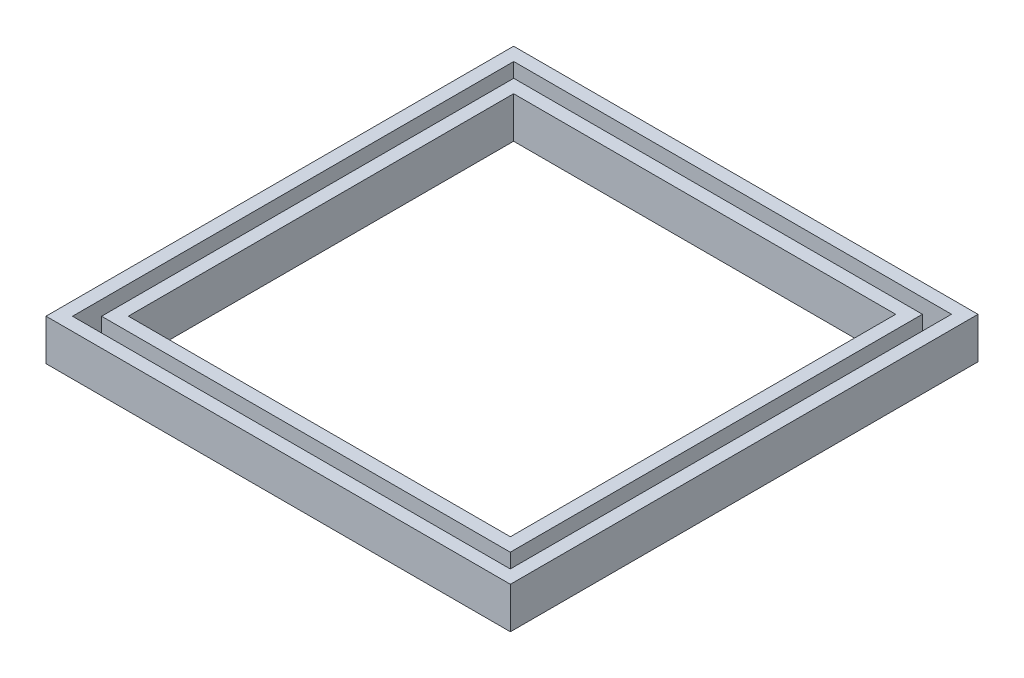
ISO-10303-21;
HEADER;
FILE_DESCRIPTION(('STEP AP214'),'2;1');
FILE_NAME('part.step','',(''),(''),'','','');
FILE_SCHEMA(('AUTOMOTIVE_DESIGN { 1 0 10303 214 1 1 1 1 }'));
ENDSEC;
DATA;
#1=APPLICATION_CONTEXT('core data for automotive mechanical design processes');
#2=APPLICATION_PROTOCOL_DEFINITION('international standard','automotive_design',2000,#1);
#3=PRODUCT_CONTEXT('',#1,'mechanical');
#4=PRODUCT('Part','Part','',(#3));
#5=PRODUCT_RELATED_PRODUCT_CATEGORY('part','',(#4));
#6=PRODUCT_DEFINITION_FORMATION('','',#4);
#7=PRODUCT_DEFINITION_CONTEXT('part definition',#1,'design');
#8=PRODUCT_DEFINITION('design','',#6,#7);
#9=PRODUCT_DEFINITION_SHAPE('','',#8);
#10=(LENGTH_UNIT() NAMED_UNIT(*) SI_UNIT(.MILLI.,.METRE.));
#11=(NAMED_UNIT(*) PLANE_ANGLE_UNIT() SI_UNIT($,.RADIAN.));
#12=(NAMED_UNIT(*) SI_UNIT($,.STERADIAN.) SOLID_ANGLE_UNIT());
#13=UNCERTAINTY_MEASURE_WITH_UNIT(LENGTH_MEASURE(1.E-05),#10,'distance_accuracy_value','');
#14=(GEOMETRIC_REPRESENTATION_CONTEXT(3) GLOBAL_UNCERTAINTY_ASSIGNED_CONTEXT((#13)) GLOBAL_UNIT_ASSIGNED_CONTEXT((#10,
#11,#12)) REPRESENTATION_CONTEXT('',''));
#15=CARTESIAN_POINT('',(0.,0.,0.));
#16=DIRECTION('',(0.,0.,1.));
#17=DIRECTION('',(1.,0.,0.));
#18=AXIS2_PLACEMENT_3D('',#15,#16,#17);
#19=CARTESIAN_POINT('',(0.,19.05,108.207890451517));
#20=DIRECTION('',(0.,0.,-1.));
#21=DIRECTION('',(-1.,0.,0.));
#22=AXIS2_PLACEMENT_3D('',#19,#20,#21);
#23=PLANE('',#22);
#24=DIRECTION('',(1.,0.,0.));
#25=VECTOR('',#24,1.);
#26=CARTESIAN_POINT('',(0.,0.,108.207890451517));
#27=LINE('',#26,#25);
#28=CARTESIAN_POINT('',(-107.46,0.,108.207890451517));
#29=VERTEX_POINT('',#28);
#30=CARTESIAN_POINT('',(107.46,0.,108.207890451517));
#31=VERTEX_POINT('',#30);
#32=EDGE_CURVE('E193',#29,#31,#27,.T.);
#33=ORIENTED_EDGE('',*,*,#32,.T.);
#34=DIRECTION('',(0.,-1.,0.));
#35=VECTOR('',#34,1.);
#36=CARTESIAN_POINT('',(107.46,19.05,108.207890451517));
#37=LINE('',#36,#35);
#38=CARTESIAN_POINT('',(107.46,19.05,108.207890451517));
#39=VERTEX_POINT('',#38);
#40=EDGE_CURVE('E13',#39,#31,#37,.T.);
#41=ORIENTED_EDGE('',*,*,#40,.F.);
#42=DIRECTION('',(1.,0.,0.));
#43=VECTOR('',#42,1.);
#44=CARTESIAN_POINT('',(0.,19.05,108.207890451517));
#45=LINE('',#44,#43);
#46=CARTESIAN_POINT('',(-107.46,19.05,108.207890451517));
#47=VERTEX_POINT('',#46);
#48=EDGE_CURVE('E157',#47,#39,#45,.T.);
#49=ORIENTED_EDGE('',*,*,#48,.F.);
#50=DIRECTION('',(0.,-1.,0.));
#51=VECTOR('',#50,1.);
#52=CARTESIAN_POINT('',(-107.46,19.05,108.207890451517));
#53=LINE('',#52,#51);
#54=EDGE_CURVE('E97',#47,#29,#53,.T.);
#55=ORIENTED_EDGE('',*,*,#54,.T.);
#56=EDGE_LOOP('',(#33,#41,#49,#55));
#57=FACE_BOUND('',#56,.T.);
#58=ADVANCED_FACE('F77',(#57),#23,.F.);
#59=CARTESIAN_POINT('',(107.46,19.05,0.));
#60=DIRECTION('',(-1.,0.,0.));
#61=DIRECTION('',(0.,0.,1.));
#62=AXIS2_PLACEMENT_3D('',#59,#60,#61);
#63=PLANE('',#62);
#64=DIRECTION('',(0.,0.,-1.));
#65=VECTOR('',#64,1.);
#66=CARTESIAN_POINT('',(107.46,0.,0.));
#67=LINE('',#66,#65);
#68=CARTESIAN_POINT('',(107.46,0.,-108.207890451517));
#69=VERTEX_POINT('',#68);
#70=EDGE_CURVE('E164',#31,#69,#67,.T.);
#71=ORIENTED_EDGE('',*,*,#70,.T.);
#72=DIRECTION('',(0.,-1.,0.));
#73=VECTOR('',#72,1.);
#74=CARTESIAN_POINT('',(107.46,19.05,-108.207890451517));
#75=LINE('',#74,#73);
#76=CARTESIAN_POINT('',(107.46,19.05,-108.207890451517));
#77=VERTEX_POINT('',#76);
#78=EDGE_CURVE('E88',#77,#69,#75,.T.);
#79=ORIENTED_EDGE('',*,*,#78,.F.);
#80=DIRECTION('',(0.,0.,-1.));
#81=VECTOR('',#80,1.);
#82=CARTESIAN_POINT('',(107.46,19.05,0.));
#83=LINE('',#82,#81);
#84=EDGE_CURVE('E151',#39,#77,#83,.T.);
#85=ORIENTED_EDGE('',*,*,#84,.F.);
#86=ORIENTED_EDGE('',*,*,#40,.T.);
#87=EDGE_LOOP('',(#71,#79,#85,#86));
#88=FACE_BOUND('',#87,.T.);
#89=ADVANCED_FACE('F163',(#88),#63,.F.);
#90=CARTESIAN_POINT('',(0.,19.05,-108.207890451517));
#91=DIRECTION('',(0.,0.,-1.));
#92=DIRECTION('',(-1.,0.,0.));
#93=AXIS2_PLACEMENT_3D('',#90,#91,#92);
#94=PLANE('',#93);
#95=DIRECTION('',(1.,0.,0.));
#96=VECTOR('',#95,1.);
#97=CARTESIAN_POINT('',(0.,0.,-108.207890451517));
#98=LINE('',#97,#96);
#99=CARTESIAN_POINT('',(-107.46,0.,-108.207890451517));
#100=VERTEX_POINT('',#99);
#101=EDGE_CURVE('E198',#100,#69,#98,.T.);
#102=ORIENTED_EDGE('',*,*,#101,.F.);
#103=DIRECTION('',(0.,-1.,0.));
#104=VECTOR('',#103,1.);
#105=CARTESIAN_POINT('',(-107.46,19.05,-108.207890451517));
#106=LINE('',#105,#104);
#107=CARTESIAN_POINT('',(-107.46,19.05,-108.207890451517));
#108=VERTEX_POINT('',#107);
#109=EDGE_CURVE('E123',#108,#100,#106,.T.);
#110=ORIENTED_EDGE('',*,*,#109,.F.);
#111=DIRECTION('',(1.,0.,0.));
#112=VECTOR('',#111,1.);
#113=CARTESIAN_POINT('',(0.,19.05,-108.207890451517));
#114=LINE('',#113,#112);
#115=EDGE_CURVE('E156',#108,#77,#114,.T.);
#116=ORIENTED_EDGE('',*,*,#115,.T.);
#117=ORIENTED_EDGE('',*,*,#78,.T.);
#118=EDGE_LOOP('',(#102,#110,#116,#117));
#119=FACE_BOUND('',#118,.T.);
#120=ADVANCED_FACE('F169',(#119),#94,.T.);
#121=CARTESIAN_POINT('',(101.3,19.05,0.));
#122=DIRECTION('',(-1.,0.,0.));
#123=DIRECTION('',(0.,0.,1.));
#124=AXIS2_PLACEMENT_3D('',#121,#122,#123);
#125=PLANE('',#124);
#126=DIRECTION('',(0.,0.,-1.));
#127=VECTOR('',#126,1.);
#128=CARTESIAN_POINT('',(101.3,0.,0.));
#129=LINE('',#128,#127);
#130=CARTESIAN_POINT('',(101.3,0.,102.1));
#131=VERTEX_POINT('',#130);
#132=CARTESIAN_POINT('',(101.3,0.,-102.1));
#133=VERTEX_POINT('',#132);
#134=EDGE_CURVE('E178',#131,#133,#129,.T.);
#135=ORIENTED_EDGE('',*,*,#134,.F.);
#136=DIRECTION('',(0.,-1.,0.));
#137=VECTOR('',#136,1.);
#138=CARTESIAN_POINT('',(101.3,19.05,102.1));
#139=LINE('',#138,#137);
#140=CARTESIAN_POINT('',(101.3,19.05,102.1));
#141=VERTEX_POINT('',#140);
#142=EDGE_CURVE('E81',#141,#131,#139,.T.);
#143=ORIENTED_EDGE('',*,*,#142,.F.);
#144=DIRECTION('',(0.,0.,-1.));
#145=VECTOR('',#144,1.);
#146=CARTESIAN_POINT('',(101.3,19.05,0.));
#147=LINE('',#146,#145);
#148=CARTESIAN_POINT('',(101.3,19.05,-102.1));
#149=VERTEX_POINT('',#148);
#150=EDGE_CURVE('E205',#141,#149,#147,.T.);
#151=ORIENTED_EDGE('',*,*,#150,.T.);
#152=DIRECTION('',(0.,-1.,0.));
#153=VECTOR('',#152,1.);
#154=CARTESIAN_POINT('',(101.3,19.05,-102.1));
#155=LINE('',#154,#153);
#156=EDGE_CURVE('E174',#149,#133,#155,.T.);
#157=ORIENTED_EDGE('',*,*,#156,.T.);
#158=EDGE_LOOP('',(#135,#143,#151,#157));
#159=FACE_BOUND('',#158,.T.);
#160=ADVANCED_FACE('F79',(#159),#125,.T.);
#161=CARTESIAN_POINT('',(0.,19.05,102.1));
#162=DIRECTION('',(0.,0.,-1.));
#163=DIRECTION('',(-1.,0.,0.));
#164=AXIS2_PLACEMENT_3D('',#161,#162,#163);
#165=PLANE('',#164);
#166=DIRECTION('',(1.,0.,0.));
#167=VECTOR('',#166,1.);
#168=CARTESIAN_POINT('',(0.,0.,102.1));
#169=LINE('',#168,#167);
#170=CARTESIAN_POINT('',(-101.3,0.,102.1));
#171=VERTEX_POINT('',#170);
#172=EDGE_CURVE('E182',#171,#131,#169,.T.);
#173=ORIENTED_EDGE('',*,*,#172,.F.);
#174=DIRECTION('',(0.,-1.,0.));
#175=VECTOR('',#174,1.);
#176=CARTESIAN_POINT('',(-101.3,19.05,102.1));
#177=LINE('',#176,#175);
#178=CARTESIAN_POINT('',(-101.3,19.05,102.1));
#179=VERTEX_POINT('',#178);
#180=EDGE_CURVE('E215',#179,#171,#177,.T.);
#181=ORIENTED_EDGE('',*,*,#180,.F.);
#182=DIRECTION('',(1.,0.,0.));
#183=VECTOR('',#182,1.);
#184=CARTESIAN_POINT('',(0.,19.05,102.1));
#185=LINE('',#184,#183);
#186=EDGE_CURVE('E226',#179,#141,#185,.T.);
#187=ORIENTED_EDGE('',*,*,#186,.T.);
#188=ORIENTED_EDGE('',*,*,#142,.T.);
#189=EDGE_LOOP('',(#173,#181,#187,#188));
#190=FACE_BOUND('',#189,.T.);
#191=ADVANCED_FACE('F224',(#190),#165,.T.);
#192=CARTESIAN_POINT('',(-101.3,19.05,0.));
#193=DIRECTION('',(-1.,0.,0.));
#194=DIRECTION('',(0.,0.,1.));
#195=AXIS2_PLACEMENT_3D('',#192,#193,#194);
#196=PLANE('',#195);
#197=DIRECTION('',(0.,0.,-1.));
#198=VECTOR('',#197,1.);
#199=CARTESIAN_POINT('',(-101.3,0.,0.));
#200=LINE('',#199,#198);
#201=CARTESIAN_POINT('',(-101.3,0.,-102.1));
#202=VERTEX_POINT('',#201);
#203=EDGE_CURVE('E186',#171,#202,#200,.T.);
#204=ORIENTED_EDGE('',*,*,#203,.T.);
#205=DIRECTION('',(0.,-1.,0.));
#206=VECTOR('',#205,1.);
#207=CARTESIAN_POINT('',(-101.3,19.05,-102.1));
#208=LINE('',#207,#206);
#209=CARTESIAN_POINT('',(-101.3,19.05,-102.1));
#210=VERTEX_POINT('',#209);
#211=EDGE_CURVE('E212',#210,#202,#208,.T.);
#212=ORIENTED_EDGE('',*,*,#211,.F.);
#213=DIRECTION('',(0.,0.,-1.));
#214=VECTOR('',#213,1.);
#215=CARTESIAN_POINT('',(-101.3,19.05,0.));
#216=LINE('',#215,#214);
#217=EDGE_CURVE('E240',#179,#210,#216,.T.);
#218=ORIENTED_EDGE('',*,*,#217,.F.);
#219=ORIENTED_EDGE('',*,*,#180,.T.);
#220=EDGE_LOOP('',(#204,#212,#218,#219));
#221=FACE_BOUND('',#220,.T.);
#222=ADVANCED_FACE('F233',(#221),#196,.F.);
#223=CARTESIAN_POINT('',(0.,19.05,-102.1));
#224=DIRECTION('',(0.,0.,-1.));
#225=DIRECTION('',(-1.,0.,0.));
#226=AXIS2_PLACEMENT_3D('',#223,#224,#225);
#227=PLANE('',#226);
#228=DIRECTION('',(1.,0.,0.));
#229=VECTOR('',#228,1.);
#230=CARTESIAN_POINT('',(0.,0.,-102.1));
#231=LINE('',#230,#229);
#232=EDGE_CURVE('E189',#202,#133,#231,.T.);
#233=ORIENTED_EDGE('',*,*,#232,.T.);
#234=ORIENTED_EDGE('',*,*,#156,.F.);
#235=DIRECTION('',(1.,0.,0.));
#236=VECTOR('',#235,1.);
#237=CARTESIAN_POINT('',(0.,19.05,-102.1));
#238=LINE('',#237,#236);
#239=EDGE_CURVE('E237',#210,#149,#238,.T.);
#240=ORIENTED_EDGE('',*,*,#239,.F.);
#241=ORIENTED_EDGE('',*,*,#211,.T.);
#242=EDGE_LOOP('',(#233,#234,#240,#241));
#243=FACE_BOUND('',#242,.T.);
#244=ADVANCED_FACE('F236',(#243),#227,.F.);
#245=CARTESIAN_POINT('',(-107.46,19.05,0.));
#246=DIRECTION('',(-1.,0.,0.));
#247=DIRECTION('',(0.,0.,1.));
#248=AXIS2_PLACEMENT_3D('',#245,#246,#247);
#249=PLANE('',#248);
#250=DIRECTION('',(0.,0.,-1.));
#251=VECTOR('',#250,1.);
#252=CARTESIAN_POINT('',(-107.46,0.,0.));
#253=LINE('',#252,#251);
#254=EDGE_CURVE('E201',#29,#100,#253,.T.);
#255=ORIENTED_EDGE('',*,*,#254,.F.);
#256=ORIENTED_EDGE('',*,*,#54,.F.);
#257=DIRECTION('',(0.,0.,-1.));
#258=VECTOR('',#257,1.);
#259=CARTESIAN_POINT('',(-107.46,19.05,0.));
#260=LINE('',#259,#258);
#261=EDGE_CURVE('E171',#47,#108,#260,.T.);
#262=ORIENTED_EDGE('',*,*,#261,.T.);
#263=ORIENTED_EDGE('',*,*,#109,.T.);
#264=EDGE_LOOP('',(#255,#256,#262,#263));
#265=FACE_BOUND('',#264,.T.);
#266=ADVANCED_FACE('F250',(#265),#249,.T.);
#267=CARTESIAN_POINT('',(0.,19.05,0.));
#268=DIRECTION('',(0.,1.,0.));
#269=DIRECTION('',(0.,0.,1.));
#270=AXIS2_PLACEMENT_3D('',#267,#268,#269);
#271=PLANE('',#270);
#272=ORIENTED_EDGE('',*,*,#150,.F.);
#273=ORIENTED_EDGE('',*,*,#186,.F.);
#274=ORIENTED_EDGE('',*,*,#217,.T.);
#275=ORIENTED_EDGE('',*,*,#239,.T.);
#276=EDGE_LOOP('',(#272,#273,#274,#275));
#277=FACE_BOUND('',#276,.T.);
#278=ORIENTED_EDGE('',*,*,#48,.T.);
#279=ORIENTED_EDGE('',*,*,#84,.T.);
#280=ORIENTED_EDGE('',*,*,#115,.F.);
#281=ORIENTED_EDGE('',*,*,#261,.F.);
#282=EDGE_LOOP('',(#278,#279,#280,#281));
#283=FACE_BOUND('',#282,.T.);
#284=ADVANCED_FACE('F153',(#277,#283),#271,.T.);
#285=CARTESIAN_POINT('',(0.,0.,0.));
#286=DIRECTION('',(0.,1.,0.));
#287=DIRECTION('',(0.,0.,1.));
#288=AXIS2_PLACEMENT_3D('',#285,#286,#287);
#289=PLANE('',#288);
#290=ORIENTED_EDGE('',*,*,#134,.T.);
#291=ORIENTED_EDGE('',*,*,#232,.F.);
#292=ORIENTED_EDGE('',*,*,#203,.F.);
#293=ORIENTED_EDGE('',*,*,#172,.T.);
#294=EDGE_LOOP('',(#290,#291,#292,#293));
#295=FACE_BOUND('',#294,.T.);
#296=ORIENTED_EDGE('',*,*,#32,.F.);
#297=ORIENTED_EDGE('',*,*,#254,.T.);
#298=ORIENTED_EDGE('',*,*,#101,.T.);
#299=ORIENTED_EDGE('',*,*,#70,.F.);
#300=EDGE_LOOP('',(#296,#297,#298,#299));
#301=FACE_BOUND('',#300,.T.);
#302=ADVANCED_FACE('F230',(#295,#301),#289,.F.);
#303=CLOSED_SHELL('',(#58,#89,#120,#160,#191,#222,#244,#266,#284,#302));
#304=MANIFOLD_SOLID_BREP('B2',#303);
#305=CARTESIAN_POINT('',(0.,19.05,95.37));
#306=DIRECTION('',(0.,0.,-1.));
#307=DIRECTION('',(-1.,0.,0.));
#308=AXIS2_PLACEMENT_3D('',#305,#306,#307);
#309=PLANE('',#308);
#310=DIRECTION('',(1.,0.,0.));
#311=VECTOR('',#310,1.);
#312=CARTESIAN_POINT('',(0.,0.,95.37));
#313=LINE('',#312,#311);
#314=CARTESIAN_POINT('',(-94.57,0.,95.37));
#315=VERTEX_POINT('',#314);
#316=CARTESIAN_POINT('',(94.57,0.,95.37));
#317=VERTEX_POINT('',#316);
#318=EDGE_CURVE('E458',#315,#317,#313,.T.);
#319=ORIENTED_EDGE('',*,*,#318,.T.);
#320=DIRECTION('',(0.,-1.,0.));
#321=VECTOR('',#320,1.);
#322=CARTESIAN_POINT('',(94.57,19.05,95.37));
#323=LINE('',#322,#321);
#324=CARTESIAN_POINT('',(94.57,19.05,95.37));
#325=VERTEX_POINT('',#324);
#326=EDGE_CURVE('E75',#325,#317,#323,.T.);
#327=ORIENTED_EDGE('',*,*,#326,.F.);
#328=DIRECTION('',(1.,0.,0.));
#329=VECTOR('',#328,1.);
#330=CARTESIAN_POINT('',(0.,19.05,95.37));
#331=LINE('',#330,#329);
#332=CARTESIAN_POINT('',(-94.57,19.05,95.37));
#333=VERTEX_POINT('',#332);
#334=EDGE_CURVE('E430',#333,#325,#331,.T.);
#335=ORIENTED_EDGE('',*,*,#334,.F.);
#336=DIRECTION('',(0.,-1.,0.));
#337=VECTOR('',#336,1.);
#338=CARTESIAN_POINT('',(-94.57,19.05,95.37));
#339=LINE('',#338,#337);
#340=EDGE_CURVE('E370',#333,#315,#339,.T.);
#341=ORIENTED_EDGE('',*,*,#340,.T.);
#342=EDGE_LOOP('',(#319,#327,#335,#341));
#343=FACE_BOUND('',#342,.T.);
#344=ADVANCED_FACE('F351',(#343),#309,.F.);
#345=CARTESIAN_POINT('',(94.57,19.05,0.));
#346=DIRECTION('',(-1.,0.,0.));
#347=DIRECTION('',(0.,0.,1.));
#348=AXIS2_PLACEMENT_3D('',#345,#346,#347);
#349=PLANE('',#348);
#350=DIRECTION('',(0.,0.,-1.));
#351=VECTOR('',#350,1.);
#352=CARTESIAN_POINT('',(94.57,0.,0.));
#353=LINE('',#352,#351);
#354=CARTESIAN_POINT('',(94.57,0.,-95.37));
#355=VERTEX_POINT('',#354);
#356=EDGE_CURVE('E436',#317,#355,#353,.T.);
#357=ORIENTED_EDGE('',*,*,#356,.T.);
#358=DIRECTION('',(0.,-1.,0.));
#359=VECTOR('',#358,1.);
#360=CARTESIAN_POINT('',(94.57,19.05,-95.37));
#361=LINE('',#360,#359);
#362=CARTESIAN_POINT('',(94.57,19.05,-95.37));
#363=VERTEX_POINT('',#362);
#364=EDGE_CURVE('E361',#363,#355,#361,.T.);
#365=ORIENTED_EDGE('',*,*,#364,.F.);
#366=DIRECTION('',(0.,0.,-1.));
#367=VECTOR('',#366,1.);
#368=CARTESIAN_POINT('',(94.57,19.05,0.));
#369=LINE('',#368,#367);
#370=EDGE_CURVE('E424',#325,#363,#369,.T.);
#371=ORIENTED_EDGE('',*,*,#370,.F.);
#372=ORIENTED_EDGE('',*,*,#326,.T.);
#373=EDGE_LOOP('',(#357,#365,#371,#372));
#374=FACE_BOUND('',#373,.T.);
#375=ADVANCED_FACE('F435',(#374),#349,.F.);
#376=CARTESIAN_POINT('',(0.,19.05,-95.37));
#377=DIRECTION('',(0.,0.,-1.));
#378=DIRECTION('',(-1.,0.,0.));
#379=AXIS2_PLACEMENT_3D('',#376,#377,#378);
#380=PLANE('',#379);
#381=DIRECTION('',(1.,0.,0.));
#382=VECTOR('',#381,1.);
#383=CARTESIAN_POINT('',(0.,0.,-95.37));
#384=LINE('',#383,#382);
#385=CARTESIAN_POINT('',(-94.57,0.,-95.37));
#386=VERTEX_POINT('',#385);
#387=EDGE_CURVE('E461',#386,#355,#384,.T.);
#388=ORIENTED_EDGE('',*,*,#387,.F.);
#389=DIRECTION('',(0.,-1.,0.));
#390=VECTOR('',#389,1.);
#391=CARTESIAN_POINT('',(-94.57,19.05,-95.37));
#392=LINE('',#391,#390);
#393=CARTESIAN_POINT('',(-94.57,19.05,-95.37));
#394=VERTEX_POINT('',#393);
#395=EDGE_CURVE('E396',#394,#386,#392,.T.);
#396=ORIENTED_EDGE('',*,*,#395,.F.);
#397=DIRECTION('',(1.,0.,0.));
#398=VECTOR('',#397,1.);
#399=CARTESIAN_POINT('',(0.,19.05,-95.37));
#400=LINE('',#399,#398);
#401=EDGE_CURVE('E429',#394,#363,#400,.T.);
#402=ORIENTED_EDGE('',*,*,#401,.T.);
#403=ORIENTED_EDGE('',*,*,#364,.T.);
#404=EDGE_LOOP('',(#388,#396,#402,#403));
#405=FACE_BOUND('',#404,.T.);
#406=ADVANCED_FACE('F440',(#405),#380,.T.);
#407=CARTESIAN_POINT('',(88.41,19.05,0.));
#408=DIRECTION('',(-1.,0.,0.));
#409=DIRECTION('',(0.,0.,1.));
#410=AXIS2_PLACEMENT_3D('',#407,#408,#409);
#411=PLANE('',#410);
#412=DIRECTION('',(0.,0.,-1.));
#413=VECTOR('',#412,1.);
#414=CARTESIAN_POINT('',(88.41,0.,0.));
#415=LINE('',#414,#413);
#416=CARTESIAN_POINT('',(88.41,0.,89.1578904515174));
#417=VERTEX_POINT('',#416);
#418=CARTESIAN_POINT('',(88.41,0.,-89.1578904515174));
#419=VERTEX_POINT('',#418);
#420=EDGE_CURVE('E447',#417,#419,#415,.T.);
#421=ORIENTED_EDGE('',*,*,#420,.F.);
#422=DIRECTION('',(0.,-1.,0.));
#423=VECTOR('',#422,1.);
#424=CARTESIAN_POINT('',(88.41,19.05,89.1578904515174));
#425=LINE('',#424,#423);
#426=CARTESIAN_POINT('',(88.41,19.05,89.1578904515174));
#427=VERTEX_POINT('',#426);
#428=EDGE_CURVE('E355',#427,#417,#425,.T.);
#429=ORIENTED_EDGE('',*,*,#428,.F.);
#430=DIRECTION('',(0.,0.,-1.));
#431=VECTOR('',#430,1.);
#432=CARTESIAN_POINT('',(88.41,19.05,0.));
#433=LINE('',#432,#431);
#434=CARTESIAN_POINT('',(88.41,19.05,-89.1578904515174));
#435=VERTEX_POINT('',#434);
#436=EDGE_CURVE('E466',#427,#435,#433,.T.);
#437=ORIENTED_EDGE('',*,*,#436,.T.);
#438=DIRECTION('',(0.,-1.,0.));
#439=VECTOR('',#438,1.);
#440=CARTESIAN_POINT('',(88.41,19.05,-89.1578904515174));
#441=LINE('',#440,#439);
#442=EDGE_CURVE('E443',#435,#419,#441,.T.);
#443=ORIENTED_EDGE('',*,*,#442,.T.);
#444=EDGE_LOOP('',(#421,#429,#437,#443));
#445=FACE_BOUND('',#444,.T.);
#446=ADVANCED_FACE('F353',(#445),#411,.T.);
#447=CARTESIAN_POINT('',(0.,19.05,89.1578904515174));
#448=DIRECTION('',(0.,0.,-1.));
#449=DIRECTION('',(-1.,0.,0.));
#450=AXIS2_PLACEMENT_3D('',#447,#448,#449);
#451=PLANE('',#450);
#452=DIRECTION('',(1.,0.,0.));
#453=VECTOR('',#452,1.);
#454=CARTESIAN_POINT('',(0.,0.,89.1578904515174));
#455=LINE('',#454,#453);
#456=CARTESIAN_POINT('',(-88.41,0.,89.1578904515174));
#457=VERTEX_POINT('',#456);
#458=EDGE_CURVE('E450',#457,#417,#455,.T.);
#459=ORIENTED_EDGE('',*,*,#458,.F.);
#460=DIRECTION('',(0.,-1.,0.));
#461=VECTOR('',#460,1.);
#462=CARTESIAN_POINT('',(-88.41,19.05,89.1578904515174));
#463=LINE('',#462,#461);
#464=CARTESIAN_POINT('',(-88.41,19.05,89.1578904515174));
#465=VERTEX_POINT('',#464);
#466=EDGE_CURVE('E472',#465,#457,#463,.T.);
#467=ORIENTED_EDGE('',*,*,#466,.F.);
#468=DIRECTION('',(1.,0.,0.));
#469=VECTOR('',#468,1.);
#470=CARTESIAN_POINT('',(0.,19.05,89.1578904515174));
#471=LINE('',#470,#469);
#472=EDGE_CURVE('E481',#465,#427,#471,.T.);
#473=ORIENTED_EDGE('',*,*,#472,.T.);
#474=ORIENTED_EDGE('',*,*,#428,.T.);
#475=EDGE_LOOP('',(#459,#467,#473,#474));
#476=FACE_BOUND('',#475,.T.);
#477=ADVANCED_FACE('F479',(#476),#451,.T.);
#478=CARTESIAN_POINT('',(-88.41,19.05,0.));
#479=DIRECTION('',(-1.,0.,0.));
#480=DIRECTION('',(0.,0.,1.));
#481=AXIS2_PLACEMENT_3D('',#478,#479,#480);
#482=PLANE('',#481);
#483=DIRECTION('',(0.,0.,-1.));
#484=VECTOR('',#483,1.);
#485=CARTESIAN_POINT('',(-88.41,0.,0.));
#486=LINE('',#485,#484);
#487=CARTESIAN_POINT('',(-88.41,0.,-89.1578904515174));
#488=VERTEX_POINT('',#487);
#489=EDGE_CURVE('E453',#457,#488,#486,.T.);
#490=ORIENTED_EDGE('',*,*,#489,.T.);
#491=DIRECTION('',(0.,-1.,0.));
#492=VECTOR('',#491,1.);
#493=CARTESIAN_POINT('',(-88.41,19.05,-89.1578904515174));
#494=LINE('',#493,#492);
#495=CARTESIAN_POINT('',(-88.41,19.05,-89.1578904515174));
#496=VERTEX_POINT('',#495);
#497=EDGE_CURVE('E470',#496,#488,#494,.T.);
#498=ORIENTED_EDGE('',*,*,#497,.F.);
#499=DIRECTION('',(0.,0.,-1.));
#500=VECTOR('',#499,1.);
#501=CARTESIAN_POINT('',(-88.41,19.05,0.));
#502=LINE('',#501,#500);
#503=EDGE_CURVE('E494',#465,#496,#502,.T.);
#504=ORIENTED_EDGE('',*,*,#503,.F.);
#505=ORIENTED_EDGE('',*,*,#466,.T.);
#506=EDGE_LOOP('',(#490,#498,#504,#505));
#507=FACE_BOUND('',#506,.T.);
#508=ADVANCED_FACE('F488',(#507),#482,.F.);
#509=CARTESIAN_POINT('',(0.,19.05,-89.1578904515174));
#510=DIRECTION('',(0.,0.,-1.));
#511=DIRECTION('',(-1.,0.,0.));
#512=AXIS2_PLACEMENT_3D('',#509,#510,#511);
#513=PLANE('',#512);
#514=DIRECTION('',(1.,0.,0.));
#515=VECTOR('',#514,1.);
#516=CARTESIAN_POINT('',(0.,0.,-89.1578904515174));
#517=LINE('',#516,#515);
#518=EDGE_CURVE('E455',#488,#419,#517,.T.);
#519=ORIENTED_EDGE('',*,*,#518,.T.);
#520=ORIENTED_EDGE('',*,*,#442,.F.);
#521=DIRECTION('',(1.,0.,0.));
#522=VECTOR('',#521,1.);
#523=CARTESIAN_POINT('',(0.,19.05,-89.1578904515174));
#524=LINE('',#523,#522);
#525=EDGE_CURVE('E492',#496,#435,#524,.T.);
#526=ORIENTED_EDGE('',*,*,#525,.F.);
#527=ORIENTED_EDGE('',*,*,#497,.T.);
#528=EDGE_LOOP('',(#519,#520,#526,#527));
#529=FACE_BOUND('',#528,.T.);
#530=ADVANCED_FACE('F491',(#529),#513,.F.);
#531=CARTESIAN_POINT('',(-94.57,19.05,0.));
#532=DIRECTION('',(-1.,0.,0.));
#533=DIRECTION('',(0.,0.,1.));
#534=AXIS2_PLACEMENT_3D('',#531,#532,#533);
#535=PLANE('',#534);
#536=DIRECTION('',(0.,0.,-1.));
#537=VECTOR('',#536,1.);
#538=CARTESIAN_POINT('',(-94.57,0.,0.));
#539=LINE('',#538,#537);
#540=EDGE_CURVE('E463',#315,#386,#539,.T.);
#541=ORIENTED_EDGE('',*,*,#540,.F.);
#542=ORIENTED_EDGE('',*,*,#340,.F.);
#543=DIRECTION('',(0.,0.,-1.));
#544=VECTOR('',#543,1.);
#545=CARTESIAN_POINT('',(-94.57,19.05,0.));
#546=LINE('',#545,#544);
#547=EDGE_CURVE('E441',#333,#394,#546,.T.);
#548=ORIENTED_EDGE('',*,*,#547,.T.);
#549=ORIENTED_EDGE('',*,*,#395,.T.);
#550=EDGE_LOOP('',(#541,#542,#548,#549));
#551=FACE_BOUND('',#550,.T.);
#552=ADVANCED_FACE('F500',(#551),#535,.T.);
#553=CARTESIAN_POINT('',(0.,19.05,0.));
#554=DIRECTION('',(0.,1.,0.));
#555=DIRECTION('',(0.,0.,1.));
#556=AXIS2_PLACEMENT_3D('',#553,#554,#555);
#557=PLANE('',#556);
#558=ORIENTED_EDGE('',*,*,#436,.F.);
#559=ORIENTED_EDGE('',*,*,#472,.F.);
#560=ORIENTED_EDGE('',*,*,#503,.T.);
#561=ORIENTED_EDGE('',*,*,#525,.T.);
#562=EDGE_LOOP('',(#558,#559,#560,#561));
#563=FACE_BOUND('',#562,.T.);
#564=ORIENTED_EDGE('',*,*,#334,.T.);
#565=ORIENTED_EDGE('',*,*,#370,.T.);
#566=ORIENTED_EDGE('',*,*,#401,.F.);
#567=ORIENTED_EDGE('',*,*,#547,.F.);
#568=EDGE_LOOP('',(#564,#565,#566,#567));
#569=FACE_BOUND('',#568,.T.);
#570=ADVANCED_FACE('F426',(#563,#569),#557,.T.);
#571=CARTESIAN_POINT('',(0.,0.,0.));
#572=DIRECTION('',(0.,1.,0.));
#573=DIRECTION('',(0.,0.,1.));
#574=AXIS2_PLACEMENT_3D('',#571,#572,#573);
#575=PLANE('',#574);
#576=ORIENTED_EDGE('',*,*,#420,.T.);
#577=ORIENTED_EDGE('',*,*,#518,.F.);
#578=ORIENTED_EDGE('',*,*,#489,.F.);
#579=ORIENTED_EDGE('',*,*,#458,.T.);
#580=EDGE_LOOP('',(#576,#577,#578,#579));
#581=FACE_BOUND('',#580,.T.);
#582=ORIENTED_EDGE('',*,*,#318,.F.);
#583=ORIENTED_EDGE('',*,*,#540,.T.);
#584=ORIENTED_EDGE('',*,*,#387,.T.);
#585=ORIENTED_EDGE('',*,*,#356,.F.);
#586=EDGE_LOOP('',(#582,#583,#584,#585));
#587=FACE_BOUND('',#586,.T.);
#588=ADVANCED_FACE('F485',(#581,#587),#575,.F.);
#589=CLOSED_SHELL('',(#344,#375,#406,#446,#477,#508,#530,#552,#570,#588));
#590=MANIFOLD_SOLID_BREP('B7',#589);
#591=ADVANCED_BREP_SHAPE_REPRESENTATION('',(#18,#304,#590),#14);
#592=SHAPE_DEFINITION_REPRESENTATION(#9,#591);
ENDSEC;
END-ISO-10303-21;
